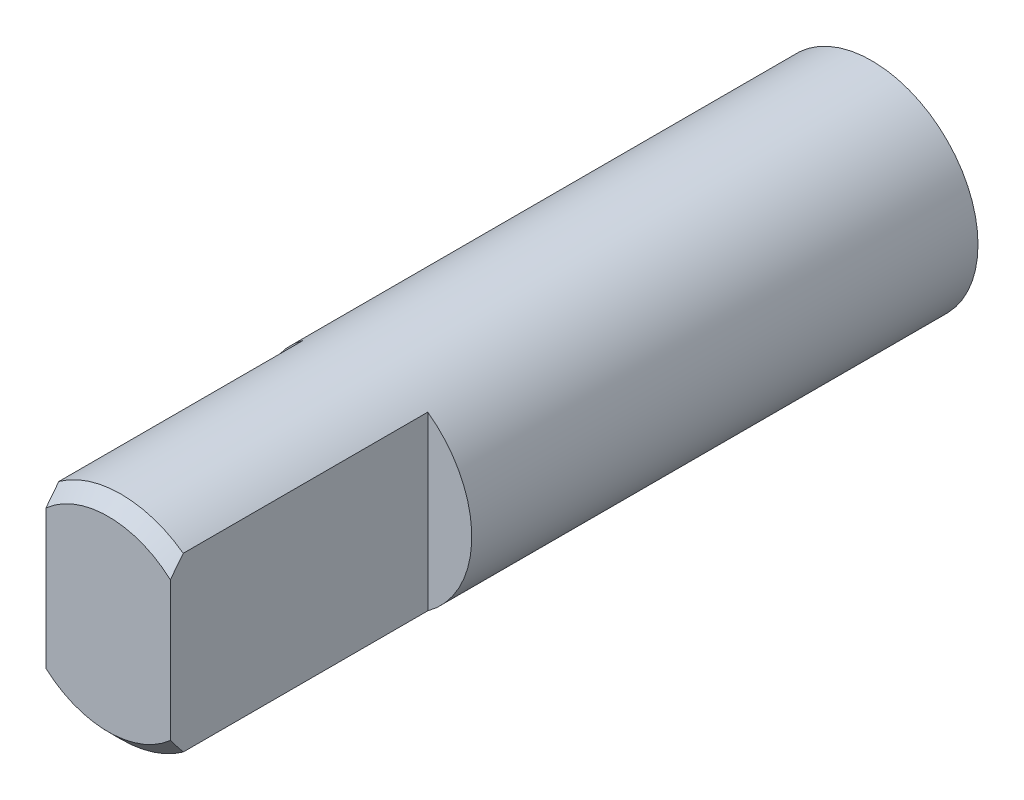
ISO-10303-21;
HEADER;
FILE_DESCRIPTION(('STEP AP214'),'2;1');
FILE_NAME('part.step','',(''),(''),'','','');
FILE_SCHEMA(('AUTOMOTIVE_DESIGN { 1 0 10303 214 1 1 1 1 }'));
ENDSEC;
DATA;
#1=APPLICATION_CONTEXT('core data for automotive mechanical design processes');
#2=APPLICATION_PROTOCOL_DEFINITION('international standard','automotive_design',2000,#1);
#3=PRODUCT_CONTEXT('',#1,'mechanical');
#4=PRODUCT('Part','Part','',(#3));
#5=PRODUCT_RELATED_PRODUCT_CATEGORY('part','',(#4));
#6=PRODUCT_DEFINITION_FORMATION('','',#4);
#7=PRODUCT_DEFINITION_CONTEXT('part definition',#1,'design');
#8=PRODUCT_DEFINITION('design','',#6,#7);
#9=PRODUCT_DEFINITION_SHAPE('','',#8);
#10=(LENGTH_UNIT() NAMED_UNIT(*) SI_UNIT(.MILLI.,.METRE.));
#11=(NAMED_UNIT(*) PLANE_ANGLE_UNIT() SI_UNIT($,.RADIAN.));
#12=(NAMED_UNIT(*) SI_UNIT($,.STERADIAN.) SOLID_ANGLE_UNIT());
#13=UNCERTAINTY_MEASURE_WITH_UNIT(LENGTH_MEASURE(1.E-05),#10,'distance_accuracy_value','');
#14=(GEOMETRIC_REPRESENTATION_CONTEXT(3) GLOBAL_UNCERTAINTY_ASSIGNED_CONTEXT((#13)) GLOBAL_UNIT_ASSIGNED_CONTEXT((#10,
#11,#12)) REPRESENTATION_CONTEXT('',''));
#15=CARTESIAN_POINT('',(0.,0.,0.));
#16=DIRECTION('',(0.,0.,1.));
#17=DIRECTION('',(1.,0.,0.));
#18=AXIS2_PLACEMENT_3D('',#15,#16,#17);
#19=CARTESIAN_POINT('',(0.,0.,17.8));
#20=DIRECTION('',(0.,0.,-1.));
#21=DIRECTION('',(-1.,0.,0.));
#22=AXIS2_PLACEMENT_3D('',#19,#20,#21);
#23=CYLINDRICAL_SURFACE('',#22,2.475);
#24=CARTESIAN_POINT('',(0.,0.,0.));
#25=DIRECTION('',(0.,0.,1.));
#26=DIRECTION('',(1.,0.,0.));
#27=AXIS2_PLACEMENT_3D('',#24,#25,#26);
#28=CIRCLE('',#27,2.475);
#29=CARTESIAN_POINT('',(2.475,0.,0.));
#30=VERTEX_POINT('',#29);
#31=EDGE_CURVE('E170',#30,#30,#28,.T.);
#32=ORIENTED_EDGE('',*,*,#31,.T.);
#33=EDGE_LOOP('',(#32));
#34=FACE_BOUND('',#33,.T.);
#35=DIRECTION('',(0.,0.,-1.));
#36=VECTOR('',#35,1.);
#37=CARTESIAN_POINT('',(1.45,-2.00577291835342,17.8));
#38=LINE('',#37,#36);
#39=CARTESIAN_POINT('',(1.45,-2.00577291835342,17.5));
#40=VERTEX_POINT('',#39);
#41=CARTESIAN_POINT('',(1.45,-2.00577291835342,11.8));
#42=VERTEX_POINT('',#41);
#43=EDGE_CURVE('E172',#40,#42,#38,.T.);
#44=ORIENTED_EDGE('',*,*,#43,.F.);
#45=CARTESIAN_POINT('',(0.,0.,17.5));
#46=DIRECTION('',(0.,0.,1.));
#47=DIRECTION('',(1.,0.,0.));
#48=AXIS2_PLACEMENT_3D('',#45,#46,#47);
#49=CIRCLE('',#48,2.475);
#50=CARTESIAN_POINT('',(-1.45,-2.00577291835342,17.5));
#51=VERTEX_POINT('',#50);
#52=EDGE_CURVE('E66',#40,#51,#49,.F.);
#53=ORIENTED_EDGE('',*,*,#52,.T.);
#54=DIRECTION('',(0.,0.,-1.));
#55=VECTOR('',#54,1.);
#56=CARTESIAN_POINT('',(-1.45,-2.00577291835342,17.8));
#57=LINE('',#56,#55);
#58=CARTESIAN_POINT('',(-1.45,-2.00577291835342,11.8));
#59=VERTEX_POINT('',#58);
#60=EDGE_CURVE('E102',#59,#51,#57,.F.);
#61=ORIENTED_EDGE('',*,*,#60,.F.);
#62=CARTESIAN_POINT('',(0.,0.,11.8));
#63=DIRECTION('',(0.,0.,1.));
#64=DIRECTION('',(1.,0.,0.));
#65=AXIS2_PLACEMENT_3D('',#62,#63,#64);
#66=CIRCLE('',#65,2.475);
#67=CARTESIAN_POINT('',(-1.45,2.00577291835342,11.8));
#68=VERTEX_POINT('',#67);
#69=EDGE_CURVE('E106',#68,#59,#66,.T.);
#70=ORIENTED_EDGE('',*,*,#69,.F.);
#71=DIRECTION('',(0.,0.,-1.));
#72=VECTOR('',#71,1.);
#73=CARTESIAN_POINT('',(-1.45,2.00577291835342,17.8));
#74=LINE('',#73,#72);
#75=CARTESIAN_POINT('',(-1.45,2.00577291835342,17.5));
#76=VERTEX_POINT('',#75);
#77=EDGE_CURVE('E95',#76,#68,#74,.T.);
#78=ORIENTED_EDGE('',*,*,#77,.F.);
#79=CARTESIAN_POINT('',(0.,0.,17.5));
#80=DIRECTION('',(0.,0.,1.));
#81=DIRECTION('',(1.,0.,0.));
#82=AXIS2_PLACEMENT_3D('',#79,#80,#81);
#83=CIRCLE('',#82,2.475);
#84=CARTESIAN_POINT('',(1.45,2.00577291835342,17.5));
#85=VERTEX_POINT('',#84);
#86=EDGE_CURVE('E185',#76,#85,#83,.F.);
#87=ORIENTED_EDGE('',*,*,#86,.T.);
#88=DIRECTION('',(0.,0.,-1.));
#89=VECTOR('',#88,1.);
#90=CARTESIAN_POINT('',(1.45,2.00577291835342,17.8));
#91=LINE('',#90,#89);
#92=CARTESIAN_POINT('',(1.45,2.00577291835342,11.8));
#93=VERTEX_POINT('',#92);
#94=EDGE_CURVE('E101',#93,#85,#91,.F.);
#95=ORIENTED_EDGE('',*,*,#94,.F.);
#96=EDGE_CURVE('E109',#42,#93,#66,.T.);
#97=ORIENTED_EDGE('',*,*,#96,.F.);
#98=EDGE_LOOP('',(#44,#53,#61,#70,#78,#87,#95,#97));
#99=FACE_BOUND('',#98,.T.);
#100=ADVANCED_FACE('F38',(#34,#99),#23,.T.);
#101=CARTESIAN_POINT('',(0.,0.,17.8));
#102=DIRECTION('',(0.,0.,1.));
#103=DIRECTION('',(1.,0.,0.));
#104=AXIS2_PLACEMENT_3D('',#101,#102,#103);
#105=PLANE('',#104);
#106=DIRECTION('',(0.,-1.,0.));
#107=VECTOR('',#106,1.);
#108=CARTESIAN_POINT('',(-1.45,0.,17.8));
#109=LINE('',#108,#107);
#110=CARTESIAN_POINT('',(-1.45,1.62114928368735,17.8));
#111=VERTEX_POINT('',#110);
#112=CARTESIAN_POINT('',(-1.45,-1.62114928368735,17.8));
#113=VERTEX_POINT('',#112);
#114=EDGE_CURVE('E114',#111,#113,#109,.T.);
#115=ORIENTED_EDGE('',*,*,#114,.T.);
#116=CARTESIAN_POINT('',(0.,0.,17.8));
#117=DIRECTION('',(0.,0.,1.));
#118=DIRECTION('',(1.,0.,0.));
#119=AXIS2_PLACEMENT_3D('',#116,#117,#118);
#120=CIRCLE('',#119,2.175);
#121=CARTESIAN_POINT('',(1.45,-1.62114928368735,17.8));
#122=VERTEX_POINT('',#121);
#123=EDGE_CURVE('E120',#113,#122,#120,.T.);
#124=ORIENTED_EDGE('',*,*,#123,.T.);
#125=DIRECTION('',(0.,1.,0.));
#126=VECTOR('',#125,1.);
#127=CARTESIAN_POINT('',(1.45,0.,17.8));
#128=LINE('',#127,#126);
#129=CARTESIAN_POINT('',(1.45,1.62114928368735,17.8));
#130=VERTEX_POINT('',#129);
#131=EDGE_CURVE('E110',#122,#130,#128,.T.);
#132=ORIENTED_EDGE('',*,*,#131,.T.);
#133=CARTESIAN_POINT('',(0.,0.,17.8));
#134=DIRECTION('',(0.,0.,1.));
#135=DIRECTION('',(1.,0.,0.));
#136=AXIS2_PLACEMENT_3D('',#133,#134,#135);
#137=CIRCLE('',#136,2.175);
#138=EDGE_CURVE('E112',#130,#111,#137,.T.);
#139=ORIENTED_EDGE('',*,*,#138,.T.);
#140=EDGE_LOOP('',(#115,#124,#132,#139));
#141=FACE_BOUND('',#140,.T.);
#142=ADVANCED_FACE('F147',(#141),#105,.T.);
#143=CARTESIAN_POINT('',(0.,0.,0.));
#144=DIRECTION('',(0.,0.,1.));
#145=DIRECTION('',(1.,0.,0.));
#146=AXIS2_PLACEMENT_3D('',#143,#144,#145);
#147=PLANE('',#146);
#148=ORIENTED_EDGE('',*,*,#31,.F.);
#149=EDGE_LOOP('',(#148));
#150=FACE_BOUND('',#149,.T.);
#151=ADVANCED_FACE('F150',(#150),#147,.F.);
#152=CARTESIAN_POINT('',(-1.45,3.5,11.8));
#153=DIRECTION('',(-1.,0.,0.));
#154=DIRECTION('',(0.,-1.,0.));
#155=AXIS2_PLACEMENT_3D('',#152,#153,#154);
#156=PLANE('',#155);
#157=ORIENTED_EDGE('',*,*,#60,.T.);
#158=CARTESIAN_POINT('',(-1.45,-2.00577291835342,17.5));
#159=CARTESIAN_POINT('',(-1.45,-1.97418866262015,17.5255950039578));
#160=CARTESIAN_POINT('',(-1.45,-1.94250387974415,17.5510665479977));
#161=CARTESIAN_POINT('',(-1.45,-1.87891204532299,17.6017238808249));
#162=CARTESIAN_POINT('',(-1.45,-1.84700501669119,17.6269096983867));
#163=CARTESIAN_POINT('',(-1.45,-1.78294045222136,17.676962439913));
#164=CARTESIAN_POINT('',(-1.45,-1.75078291158453,17.7018293577444));
#165=CARTESIAN_POINT('',(-1.45,-1.68618492746668,17.7511996702028));
#166=CARTESIAN_POINT('',(-1.45,-1.65374445554357,17.7757030275977));
#167=CARTESIAN_POINT('',(-1.45,-1.62114928368749,17.8000000000002));
#168=B_SPLINE_CURVE_WITH_KNOTS('',3,(#158,#159,#160,#161,#162,#163,#164,#165,#166,#167),
.UNSPECIFIED.,.F.,.F.,(4,2,2,2,4),(0.,0.121959331011143,0.24390626893848,0.365855548657561,
0.487817232151487),.UNSPECIFIED.);
#169=EDGE_CURVE('E12',#51,#113,#168,.T.);
#170=ORIENTED_EDGE('',*,*,#169,.T.);
#171=ORIENTED_EDGE('',*,*,#114,.F.);
#172=CARTESIAN_POINT('',(-1.45,1.62114928368735,17.8));
#173=CARTESIAN_POINT('',(-1.45,1.65374445554351,17.7757030275977));
#174=CARTESIAN_POINT('',(-1.45,1.68618492746666,17.7511996702028));
#175=CARTESIAN_POINT('',(-1.45,1.75078291158454,17.7018293577444));
#176=CARTESIAN_POINT('',(-1.45,1.78294045222137,17.676962439913));
#177=CARTESIAN_POINT('',(-1.45,1.84700501669118,17.6269096983867));
#178=CARTESIAN_POINT('',(-1.45,1.87891204532298,17.6017238808249));
#179=CARTESIAN_POINT('',(-1.45,1.94250387974415,17.5510665479977));
#180=CARTESIAN_POINT('',(-1.45,1.97418866262017,17.5255950039579));
#181=CARTESIAN_POINT('',(-1.45,2.00577291835348,17.5000000000001));
#182=B_SPLINE_CURVE_WITH_KNOTS('',3,(#172,#173,#174,#175,#176,#177,#178,#179,#180,#181),
.UNSPECIFIED.,.F.,.F.,(4,2,2,2,4),(0.,0.121961683493927,0.243910963213009,0.365857901140345,
0.487817232151492),.UNSPECIFIED.);
#183=EDGE_CURVE('E52',#111,#76,#182,.T.);
#184=ORIENTED_EDGE('',*,*,#183,.T.);
#185=ORIENTED_EDGE('',*,*,#77,.T.);
#186=DIRECTION('',(0.,-1.,0.));
#187=VECTOR('',#186,1.);
#188=CARTESIAN_POINT('',(-1.45,3.5,11.8));
#189=LINE('',#188,#187);
#190=EDGE_CURVE('E98',#68,#59,#189,.T.);
#191=ORIENTED_EDGE('',*,*,#190,.T.);
#192=EDGE_LOOP('',(#157,#170,#171,#184,#185,#191));
#193=FACE_BOUND('',#192,.T.);
#194=ADVANCED_FACE('F97',(#193),#156,.T.);
#195=CARTESIAN_POINT('',(0.,0.,11.8));
#196=DIRECTION('',(0.,0.,1.));
#197=DIRECTION('',(1.,0.,0.));
#198=AXIS2_PLACEMENT_3D('',#195,#196,#197);
#199=PLANE('',#198);
#200=ORIENTED_EDGE('',*,*,#69,.T.);
#201=ORIENTED_EDGE('',*,*,#190,.F.);
#202=EDGE_LOOP('',(#200,#201));
#203=FACE_BOUND('',#202,.T.);
#204=ADVANCED_FACE('F105',(#203),#199,.T.);
#205=ORIENTED_EDGE('',*,*,#96,.T.);
#206=DIRECTION('',(0.,1.,0.));
#207=VECTOR('',#206,1.);
#208=CARTESIAN_POINT('',(1.45,3.5,11.8));
#209=LINE('',#208,#207);
#210=EDGE_CURVE('E107',#42,#93,#209,.T.);
#211=ORIENTED_EDGE('',*,*,#210,.F.);
#212=EDGE_LOOP('',(#205,#211));
#213=FACE_BOUND('',#212,.T.);
#214=ADVANCED_FACE('F141',(#213),#199,.T.);
#215=CARTESIAN_POINT('',(1.45,3.5,11.8));
#216=DIRECTION('',(1.,0.,0.));
#217=DIRECTION('',(0.,0.,-1.));
#218=AXIS2_PLACEMENT_3D('',#215,#216,#217);
#219=PLANE('',#218);
#220=ORIENTED_EDGE('',*,*,#131,.F.);
#221=CARTESIAN_POINT('',(1.45,-1.62114928368735,17.8));
#222=CARTESIAN_POINT('',(1.45,-1.65374445554351,17.7757030275977));
#223=CARTESIAN_POINT('',(1.45,-1.68618492746666,17.7511996702028));
#224=CARTESIAN_POINT('',(1.45,-1.75078291158454,17.7018293577444));
#225=CARTESIAN_POINT('',(1.45,-1.78294045222137,17.676962439913));
#226=CARTESIAN_POINT('',(1.45,-1.84700501669118,17.6269096983867));
#227=CARTESIAN_POINT('',(1.45,-1.87891204532298,17.6017238808249));
#228=CARTESIAN_POINT('',(1.45,-1.94250387974415,17.5510665479977));
#229=CARTESIAN_POINT('',(1.45,-1.97418866262017,17.5255950039579));
#230=CARTESIAN_POINT('',(1.45,-2.00577291835348,17.5000000000001));
#231=B_SPLINE_CURVE_WITH_KNOTS('',3,(#221,#222,#223,#224,#225,#226,#227,#228,#229,#230),
.UNSPECIFIED.,.F.,.F.,(4,2,2,2,4),(0.,0.121961683493927,0.243910963213009,0.365857901140345,
0.487817232151492),.UNSPECIFIED.);
#232=EDGE_CURVE('E130',#122,#40,#231,.T.);
#233=ORIENTED_EDGE('',*,*,#232,.T.);
#234=ORIENTED_EDGE('',*,*,#43,.T.);
#235=ORIENTED_EDGE('',*,*,#210,.T.);
#236=ORIENTED_EDGE('',*,*,#94,.T.);
#237=CARTESIAN_POINT('',(1.45,2.00577291835342,17.5));
#238=CARTESIAN_POINT('',(1.45,1.97418866262015,17.5255950039578));
#239=CARTESIAN_POINT('',(1.45,1.94250387974415,17.5510665479977));
#240=CARTESIAN_POINT('',(1.45,1.87891204532299,17.6017238808249));
#241=CARTESIAN_POINT('',(1.45,1.84700501669119,17.6269096983867));
#242=CARTESIAN_POINT('',(1.45,1.78294045222136,17.676962439913));
#243=CARTESIAN_POINT('',(1.45,1.75078291158453,17.7018293577444));
#244=CARTESIAN_POINT('',(1.45,1.68618492746668,17.7511996702028));
#245=CARTESIAN_POINT('',(1.45,1.65374445554357,17.7757030275977));
#246=CARTESIAN_POINT('',(1.45,1.62114928368749,17.8000000000002));
#247=B_SPLINE_CURVE_WITH_KNOTS('',3,(#237,#238,#239,#240,#241,#242,#243,#244,#245,#246),
.UNSPECIFIED.,.F.,.F.,(4,2,2,2,4),(0.,0.121959331011143,0.24390626893848,0.365855548657561,
0.487817232151487),.UNSPECIFIED.);
#248=EDGE_CURVE('E123',#85,#130,#247,.T.);
#249=ORIENTED_EDGE('',*,*,#248,.T.);
#250=EDGE_LOOP('',(#220,#233,#234,#235,#236,#249));
#251=FACE_BOUND('',#250,.T.);
#252=ADVANCED_FACE('F136',(#251),#219,.T.);
#253=CARTESIAN_POINT('',(0.,0.,17.8));
#254=DIRECTION('',(0.,0.,-1.));
#255=DIRECTION('',(-1.,0.,0.));
#256=AXIS2_PLACEMENT_3D('',#253,#254,#255);
#257=CONICAL_SURFACE('',#256,2.175,0.785398163397452);
#258=ORIENTED_EDGE('',*,*,#169,.F.);
#259=ORIENTED_EDGE('',*,*,#52,.F.);
#260=ORIENTED_EDGE('',*,*,#232,.F.);
#261=ORIENTED_EDGE('',*,*,#123,.F.);
#262=EDGE_LOOP('',(#258,#259,#260,#261));
#263=FACE_BOUND('',#262,.T.);
#264=ADVANCED_FACE('F140',(#263),#257,.T.);
#265=CARTESIAN_POINT('',(0.,0.,17.8));
#266=DIRECTION('',(0.,0.,-1.));
#267=DIRECTION('',(-1.,0.,0.));
#268=AXIS2_PLACEMENT_3D('',#265,#266,#267);
#269=CONICAL_SURFACE('',#268,2.175,0.785398163397452);
#270=ORIENTED_EDGE('',*,*,#248,.F.);
#271=ORIENTED_EDGE('',*,*,#86,.F.);
#272=ORIENTED_EDGE('',*,*,#183,.F.);
#273=ORIENTED_EDGE('',*,*,#138,.F.);
#274=EDGE_LOOP('',(#270,#271,#272,#273));
#275=FACE_BOUND('',#274,.T.);
#276=ADVANCED_FACE('F40',(#275),#269,.T.);
#277=CLOSED_SHELL('',(#100,#142,#151,#194,#204,#214,#252,#264,#276));
#278=MANIFOLD_SOLID_BREP('B2',#277);
#279=ADVANCED_BREP_SHAPE_REPRESENTATION('',(#18,#278),#14);
#280=SHAPE_DEFINITION_REPRESENTATION(#9,#279);
ENDSEC;
END-ISO-10303-21;
